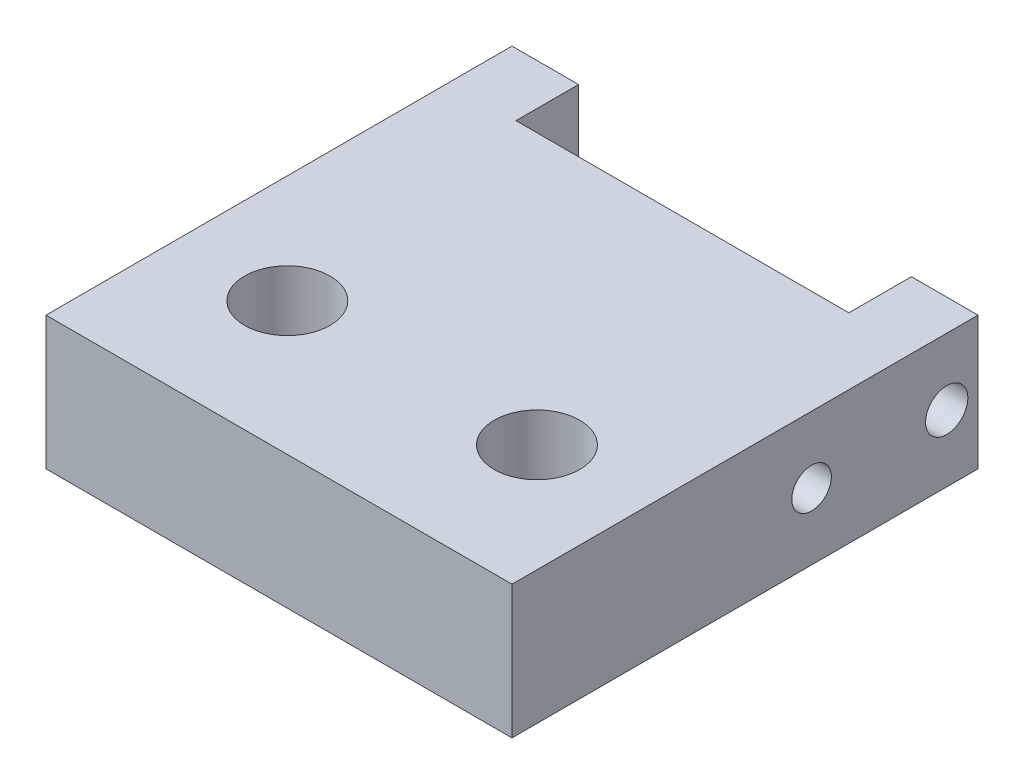
ISO-10303-21;
HEADER;
FILE_DESCRIPTION(('STEP AP214'),'2;1');
FILE_NAME('part.step','',(''),(''),'','','');
FILE_SCHEMA(('AUTOMOTIVE_DESIGN { 1 0 10303 214 1 1 1 1 }'));
ENDSEC;
DATA;
#1=APPLICATION_CONTEXT('core data for automotive mechanical design processes');
#2=APPLICATION_PROTOCOL_DEFINITION('international standard','automotive_design',2000,#1);
#3=PRODUCT_CONTEXT('',#1,'mechanical');
#4=PRODUCT('Part','Part','',(#3));
#5=PRODUCT_RELATED_PRODUCT_CATEGORY('part','',(#4));
#6=PRODUCT_DEFINITION_FORMATION('','',#4);
#7=PRODUCT_DEFINITION_CONTEXT('part definition',#1,'design');
#8=PRODUCT_DEFINITION('design','',#6,#7);
#9=PRODUCT_DEFINITION_SHAPE('','',#8);
#10=(LENGTH_UNIT() NAMED_UNIT(*) SI_UNIT(.MILLI.,.METRE.));
#11=(NAMED_UNIT(*) PLANE_ANGLE_UNIT() SI_UNIT($,.RADIAN.));
#12=(NAMED_UNIT(*) SI_UNIT($,.STERADIAN.) SOLID_ANGLE_UNIT());
#13=UNCERTAINTY_MEASURE_WITH_UNIT(LENGTH_MEASURE(1.E-05),#10,'distance_accuracy_value','');
#14=(GEOMETRIC_REPRESENTATION_CONTEXT(3) GLOBAL_UNCERTAINTY_ASSIGNED_CONTEXT((#13)) GLOBAL_UNIT_ASSIGNED_CONTEXT((#10,
#11,#12)) REPRESENTATION_CONTEXT('',''));
#15=CARTESIAN_POINT('',(0.,0.,0.));
#16=DIRECTION('',(0.,0.,1.));
#17=DIRECTION('',(1.,0.,0.));
#18=AXIS2_PLACEMENT_3D('',#15,#16,#17);
#19=CARTESIAN_POINT('',(-8.89,5.08,-8.89));
#20=DIRECTION('',(0.,0.,1.));
#21=DIRECTION('',(1.,0.,0.));
#22=AXIS2_PLACEMENT_3D('',#19,#20,#21);
#23=PLANE('',#22);
#24=DIRECTION('',(0.,-1.,0.));
#25=VECTOR('',#24,1.);
#26=CARTESIAN_POINT('',(6.34999999999999,5.08,-8.89));
#27=LINE('',#26,#25);
#28=CARTESIAN_POINT('',(6.34999999999999,5.08,-8.89));
#29=VERTEX_POINT('',#28);
#30=CARTESIAN_POINT('',(6.34999999999999,0.,-8.89));
#31=VERTEX_POINT('',#30);
#32=EDGE_CURVE('E183',#29,#31,#27,.T.);
#33=ORIENTED_EDGE('',*,*,#32,.F.);
#34=DIRECTION('',(-1.,0.,0.));
#35=VECTOR('',#34,1.);
#36=CARTESIAN_POINT('',(-8.89,5.08,-8.89));
#37=LINE('',#36,#35);
#38=CARTESIAN_POINT('',(8.89,5.08,-8.89));
#39=VERTEX_POINT('',#38);
#40=EDGE_CURVE('E100',#39,#29,#37,.T.);
#41=ORIENTED_EDGE('',*,*,#40,.F.);
#42=DIRECTION('',(0.,-1.,0.));
#43=VECTOR('',#42,1.);
#44=CARTESIAN_POINT('',(8.89,5.08,-8.89));
#45=LINE('',#44,#43);
#46=CARTESIAN_POINT('',(8.89,0.,-8.89));
#47=VERTEX_POINT('',#46);
#48=EDGE_CURVE('E175',#39,#47,#45,.T.);
#49=ORIENTED_EDGE('',*,*,#48,.T.);
#50=DIRECTION('',(-1.,0.,0.));
#51=VECTOR('',#50,1.);
#52=CARTESIAN_POINT('',(-8.89,0.,-8.89));
#53=LINE('',#52,#51);
#54=EDGE_CURVE('E148',#47,#31,#53,.T.);
#55=ORIENTED_EDGE('',*,*,#54,.T.);
#56=EDGE_LOOP('',(#33,#41,#49,#55));
#57=FACE_BOUND('',#56,.T.);
#58=ADVANCED_FACE('F45',(#57),#23,.F.);
#59=CARTESIAN_POINT('',(8.89,5.08,8.89));
#60=DIRECTION('',(-1.,0.,0.));
#61=DIRECTION('',(0.,0.,1.));
#62=AXIS2_PLACEMENT_3D('',#59,#60,#61);
#63=PLANE('',#62);
#64=CARTESIAN_POINT('',(8.89,2.54,-2.54));
#65=DIRECTION('',(1.,0.,0.));
#66=DIRECTION('',(0.,0.,-1.));
#67=AXIS2_PLACEMENT_3D('',#64,#65,#66);
#68=CIRCLE('',#67,0.755649999999988);
#69=CARTESIAN_POINT('',(8.89,2.54,-3.29564999999999));
#70=VERTEX_POINT('',#69);
#71=EDGE_CURVE('E247',#70,#70,#68,.T.);
#72=ORIENTED_EDGE('',*,*,#71,.F.);
#73=EDGE_LOOP('',(#72));
#74=FACE_BOUND('',#73,.T.);
#75=CARTESIAN_POINT('',(8.89,2.54,-7.6962));
#76=DIRECTION('',(1.,0.,0.));
#77=DIRECTION('',(0.,0.,-1.));
#78=AXIS2_PLACEMENT_3D('',#75,#76,#77);
#79=CIRCLE('',#78,0.806449999999998);
#80=CARTESIAN_POINT('',(8.89,2.54,-8.50265));
#81=VERTEX_POINT('',#80);
#82=EDGE_CURVE('E239',#81,#81,#79,.T.);
#83=ORIENTED_EDGE('',*,*,#82,.F.);
#84=EDGE_LOOP('',(#83));
#85=FACE_BOUND('',#84,.T.);
#86=DIRECTION('',(0.,0.,-1.));
#87=VECTOR('',#86,1.);
#88=CARTESIAN_POINT('',(8.89,0.,8.89));
#89=LINE('',#88,#87);
#90=CARTESIAN_POINT('',(8.89,0.,8.89));
#91=VERTEX_POINT('',#90);
#92=EDGE_CURVE('E149',#91,#47,#89,.T.);
#93=ORIENTED_EDGE('',*,*,#92,.T.);
#94=ORIENTED_EDGE('',*,*,#48,.F.);
#95=DIRECTION('',(0.,0.,-1.));
#96=VECTOR('',#95,1.);
#97=CARTESIAN_POINT('',(8.89,5.08,8.89));
#98=LINE('',#97,#96);
#99=CARTESIAN_POINT('',(8.89,5.08,8.89));
#100=VERTEX_POINT('',#99);
#101=EDGE_CURVE('E165',#100,#39,#98,.T.);
#102=ORIENTED_EDGE('',*,*,#101,.F.);
#103=DIRECTION('',(0.,-1.,0.));
#104=VECTOR('',#103,1.);
#105=CARTESIAN_POINT('',(8.89,5.08,8.89));
#106=LINE('',#105,#104);
#107=EDGE_CURVE('E166',#100,#91,#106,.T.);
#108=ORIENTED_EDGE('',*,*,#107,.T.);
#109=EDGE_LOOP('',(#93,#94,#102,#108));
#110=FACE_BOUND('',#109,.T.);
#111=ADVANCED_FACE('F47',(#74,#85,#110),#63,.F.);
#112=CARTESIAN_POINT('',(-6.35,5.08,-8.89));
#113=VERTEX_POINT('',#112);
#114=CARTESIAN_POINT('',(-8.89,5.08,-8.89));
#115=VERTEX_POINT('',#114);
#116=EDGE_CURVE('E198',#113,#115,#37,.T.);
#117=ORIENTED_EDGE('',*,*,#116,.F.);
#118=DIRECTION('',(0.,-1.,0.));
#119=VECTOR('',#118,1.);
#120=CARTESIAN_POINT('',(-6.35,5.08,-8.89));
#121=LINE('',#120,#119);
#122=CARTESIAN_POINT('',(-6.35,0.,-8.89));
#123=VERTEX_POINT('',#122);
#124=EDGE_CURVE('E157',#113,#123,#121,.T.);
#125=ORIENTED_EDGE('',*,*,#124,.T.);
#126=CARTESIAN_POINT('',(-8.89,0.,-8.89));
#127=VERTEX_POINT('',#126);
#128=EDGE_CURVE('E142',#123,#127,#53,.T.);
#129=ORIENTED_EDGE('',*,*,#128,.T.);
#130=DIRECTION('',(0.,-1.,0.));
#131=VECTOR('',#130,1.);
#132=CARTESIAN_POINT('',(-8.89,5.08,-8.89));
#133=LINE('',#132,#131);
#134=EDGE_CURVE('E172',#115,#127,#133,.T.);
#135=ORIENTED_EDGE('',*,*,#134,.F.);
#136=EDGE_LOOP('',(#117,#125,#129,#135));
#137=FACE_BOUND('',#136,.T.);
#138=ADVANCED_FACE('F258',(#137),#23,.F.);
#139=CARTESIAN_POINT('',(-8.89,5.08,8.89));
#140=DIRECTION('',(1.,0.,0.));
#141=DIRECTION('',(0.,0.,-1.));
#142=AXIS2_PLACEMENT_3D('',#139,#140,#141);
#143=PLANE('',#142);
#144=CARTESIAN_POINT('',(-8.89,2.54,-2.54));
#145=DIRECTION('',(1.,0.,0.));
#146=DIRECTION('',(0.,0.,-1.));
#147=AXIS2_PLACEMENT_3D('',#144,#145,#146);
#148=CIRCLE('',#147,0.755649999999997);
#149=CARTESIAN_POINT('',(-8.89,2.54,-3.29565));
#150=VERTEX_POINT('',#149);
#151=EDGE_CURVE('E243',#150,#150,#148,.T.);
#152=ORIENTED_EDGE('',*,*,#151,.T.);
#153=EDGE_LOOP('',(#152));
#154=FACE_BOUND('',#153,.T.);
#155=CARTESIAN_POINT('',(-8.89,2.54,-7.6962));
#156=DIRECTION('',(1.,0.,0.));
#157=DIRECTION('',(0.,0.,-1.));
#158=AXIS2_PLACEMENT_3D('',#155,#156,#157);
#159=CIRCLE('',#158,0.806449999999995);
#160=CARTESIAN_POINT('',(-8.89,2.54,-8.50264999999999));
#161=VERTEX_POINT('',#160);
#162=EDGE_CURVE('E235',#161,#161,#159,.T.);
#163=ORIENTED_EDGE('',*,*,#162,.T.);
#164=EDGE_LOOP('',(#163));
#165=FACE_BOUND('',#164,.T.);
#166=DIRECTION('',(0.,0.,1.));
#167=VECTOR('',#166,1.);
#168=CARTESIAN_POINT('',(-8.89,0.,8.89));
#169=LINE('',#168,#167);
#170=CARTESIAN_POINT('',(-8.89,0.,8.89));
#171=VERTEX_POINT('',#170);
#172=EDGE_CURVE('E143',#127,#171,#169,.T.);
#173=ORIENTED_EDGE('',*,*,#172,.T.);
#174=DIRECTION('',(0.,-1.,0.));
#175=VECTOR('',#174,1.);
#176=CARTESIAN_POINT('',(-8.89,5.08,8.89));
#177=LINE('',#176,#175);
#178=CARTESIAN_POINT('',(-8.89,5.08,8.89));
#179=VERTEX_POINT('',#178);
#180=EDGE_CURVE('E169',#179,#171,#177,.T.);
#181=ORIENTED_EDGE('',*,*,#180,.F.);
#182=DIRECTION('',(0.,0.,1.));
#183=VECTOR('',#182,1.);
#184=CARTESIAN_POINT('',(-8.89,5.08,8.89));
#185=LINE('',#184,#183);
#186=EDGE_CURVE('E190',#115,#179,#185,.T.);
#187=ORIENTED_EDGE('',*,*,#186,.F.);
#188=ORIENTED_EDGE('',*,*,#134,.T.);
#189=EDGE_LOOP('',(#173,#181,#187,#188));
#190=FACE_BOUND('',#189,.T.);
#191=ADVANCED_FACE('F282',(#154,#165,#190),#143,.F.);
#192=CARTESIAN_POINT('',(-8.89,5.08,8.89));
#193=DIRECTION('',(0.,0.,-1.));
#194=DIRECTION('',(-1.,0.,0.));
#195=AXIS2_PLACEMENT_3D('',#192,#193,#194);
#196=PLANE('',#195);
#197=DIRECTION('',(1.,0.,0.));
#198=VECTOR('',#197,1.);
#199=CARTESIAN_POINT('',(-8.89,0.,8.89));
#200=LINE('',#199,#198);
#201=EDGE_CURVE('E92',#171,#91,#200,.T.);
#202=ORIENTED_EDGE('',*,*,#201,.T.);
#203=ORIENTED_EDGE('',*,*,#107,.F.);
#204=DIRECTION('',(1.,0.,0.));
#205=VECTOR('',#204,1.);
#206=CARTESIAN_POINT('',(-8.89,5.08,8.89));
#207=LINE('',#206,#205);
#208=EDGE_CURVE('E71',#179,#100,#207,.T.);
#209=ORIENTED_EDGE('',*,*,#208,.F.);
#210=ORIENTED_EDGE('',*,*,#180,.T.);
#211=EDGE_LOOP('',(#202,#203,#209,#210));
#212=FACE_BOUND('',#211,.T.);
#213=ADVANCED_FACE('F187',(#212),#196,.F.);
#214=CARTESIAN_POINT('',(0.,5.08,0.));
#215=DIRECTION('',(0.,-1.,0.));
#216=DIRECTION('',(0.,0.,-1.));
#217=AXIS2_PLACEMENT_3D('',#214,#215,#216);
#218=PLANE('',#217);
#219=CARTESIAN_POINT('',(4.7625,5.08,3.81));
#220=DIRECTION('',(0.,1.,0.));
#221=DIRECTION('',(0.,0.,1.));
#222=AXIS2_PLACEMENT_3D('',#219,#220,#221);
#223=CIRCLE('',#222,1.63195);
#224=CARTESIAN_POINT('',(4.7625,5.08,5.44195));
#225=VERTEX_POINT('',#224);
#226=EDGE_CURVE('E227',#225,#225,#223,.T.);
#227=ORIENTED_EDGE('',*,*,#226,.F.);
#228=EDGE_LOOP('',(#227));
#229=FACE_BOUND('',#228,.T.);
#230=CARTESIAN_POINT('',(-4.7625,5.08,3.81));
#231=DIRECTION('',(0.,1.,0.));
#232=DIRECTION('',(0.,0.,1.));
#233=AXIS2_PLACEMENT_3D('',#230,#231,#232);
#234=CIRCLE('',#233,1.63195);
#235=CARTESIAN_POINT('',(-4.7625,5.08,5.44195));
#236=VERTEX_POINT('',#235);
#237=EDGE_CURVE('E219',#236,#236,#234,.T.);
#238=ORIENTED_EDGE('',*,*,#237,.F.);
#239=EDGE_LOOP('',(#238));
#240=FACE_BOUND('',#239,.T.);
#241=DIRECTION('',(1.,0.,0.));
#242=VECTOR('',#241,1.);
#243=CARTESIAN_POINT('',(-6.35,5.08,-6.5024));
#244=LINE('',#243,#242);
#245=CARTESIAN_POINT('',(-6.35,5.08,-6.5024));
#246=VERTEX_POINT('',#245);
#247=CARTESIAN_POINT('',(6.34999999999999,5.08,-6.5024));
#248=VERTEX_POINT('',#247);
#249=EDGE_CURVE('E210',#246,#248,#244,.T.);
#250=ORIENTED_EDGE('',*,*,#249,.F.);
#251=DIRECTION('',(0.,0.,1.));
#252=VECTOR('',#251,1.);
#253=CARTESIAN_POINT('',(-6.35,5.08,-11.2776));
#254=LINE('',#253,#252);
#255=EDGE_CURVE('E127',#113,#246,#254,.T.);
#256=ORIENTED_EDGE('',*,*,#255,.F.);
#257=ORIENTED_EDGE('',*,*,#116,.T.);
#258=ORIENTED_EDGE('',*,*,#186,.T.);
#259=ORIENTED_EDGE('',*,*,#208,.T.);
#260=ORIENTED_EDGE('',*,*,#101,.T.);
#261=ORIENTED_EDGE('',*,*,#40,.T.);
#262=DIRECTION('',(0.,0.,1.));
#263=VECTOR('',#262,1.);
#264=CARTESIAN_POINT('',(6.34999999999999,5.08,-11.2776));
#265=LINE('',#264,#263);
#266=EDGE_CURVE('E137',#29,#248,#265,.T.);
#267=ORIENTED_EDGE('',*,*,#266,.T.);
#268=EDGE_LOOP('',(#250,#256,#257,#258,#259,#260,#261,#267));
#269=FACE_BOUND('',#268,.T.);
#270=ADVANCED_FACE('F344',(#229,#240,#269),#218,.F.);
#271=CARTESIAN_POINT('',(0.,0.,0.));
#272=DIRECTION('',(0.,-1.,0.));
#273=DIRECTION('',(0.,0.,-1.));
#274=AXIS2_PLACEMENT_3D('',#271,#272,#273);
#275=PLANE('',#274);
#276=CARTESIAN_POINT('',(4.7625,0.,3.81));
#277=DIRECTION('',(0.,1.,0.));
#278=DIRECTION('',(0.,0.,1.));
#279=AXIS2_PLACEMENT_3D('',#276,#277,#278);
#280=CIRCLE('',#279,1.63195);
#281=CARTESIAN_POINT('',(4.7625,0.,5.44195));
#282=VERTEX_POINT('',#281);
#283=EDGE_CURVE('E223',#282,#282,#280,.T.);
#284=ORIENTED_EDGE('',*,*,#283,.T.);
#285=EDGE_LOOP('',(#284));
#286=FACE_BOUND('',#285,.T.);
#287=CARTESIAN_POINT('',(-4.7625,0.,3.81));
#288=DIRECTION('',(0.,1.,0.));
#289=DIRECTION('',(0.,0.,1.));
#290=AXIS2_PLACEMENT_3D('',#287,#288,#289);
#291=CIRCLE('',#290,1.63195);
#292=CARTESIAN_POINT('',(-4.7625,0.,5.44195));
#293=VERTEX_POINT('',#292);
#294=EDGE_CURVE('E214',#293,#293,#291,.T.);
#295=ORIENTED_EDGE('',*,*,#294,.T.);
#296=EDGE_LOOP('',(#295));
#297=FACE_BOUND('',#296,.T.);
#298=DIRECTION('',(0.,0.,-1.));
#299=VECTOR('',#298,1.);
#300=CARTESIAN_POINT('',(-6.35,0.,0.));
#301=LINE('',#300,#299);
#302=CARTESIAN_POINT('',(-6.35,0.,-6.5024));
#303=VERTEX_POINT('',#302);
#304=EDGE_CURVE('E11',#303,#123,#301,.T.);
#305=ORIENTED_EDGE('',*,*,#304,.F.);
#306=DIRECTION('',(1.,0.,0.));
#307=VECTOR('',#306,1.);
#308=CARTESIAN_POINT('',(-6.35,0.,-6.5024));
#309=LINE('',#308,#307);
#310=CARTESIAN_POINT('',(6.34999999999999,0.,-6.5024));
#311=VERTEX_POINT('',#310);
#312=EDGE_CURVE('E130',#303,#311,#309,.T.);
#313=ORIENTED_EDGE('',*,*,#312,.T.);
#314=DIRECTION('',(0.,0.,-1.));
#315=VECTOR('',#314,1.);
#316=CARTESIAN_POINT('',(6.34999999999999,0.,0.));
#317=LINE('',#316,#315);
#318=EDGE_CURVE('E55',#311,#31,#317,.T.);
#319=ORIENTED_EDGE('',*,*,#318,.T.);
#320=ORIENTED_EDGE('',*,*,#54,.F.);
#321=ORIENTED_EDGE('',*,*,#92,.F.);
#322=ORIENTED_EDGE('',*,*,#201,.F.);
#323=ORIENTED_EDGE('',*,*,#172,.F.);
#324=ORIENTED_EDGE('',*,*,#128,.F.);
#325=EDGE_LOOP('',(#305,#313,#319,#320,#321,#322,#323,#324));
#326=FACE_BOUND('',#325,.T.);
#327=ADVANCED_FACE('F140',(#286,#297,#326),#275,.T.);
#328=CARTESIAN_POINT('',(-6.35,0.,-11.2776));
#329=DIRECTION('',(-1.,0.,0.));
#330=DIRECTION('',(0.,0.,1.));
#331=AXIS2_PLACEMENT_3D('',#328,#329,#330);
#332=PLANE('',#331);
#333=CARTESIAN_POINT('',(-6.35,2.54,-7.6962));
#334=DIRECTION('',(-1.,0.,0.));
#335=DIRECTION('',(0.,0.,1.));
#336=AXIS2_PLACEMENT_3D('',#333,#334,#335);
#337=CIRCLE('',#336,0.806449999999997);
#338=CARTESIAN_POINT('',(-6.35,2.54,-6.88975));
#339=VERTEX_POINT('',#338);
#340=EDGE_CURVE('E231',#339,#339,#337,.T.);
#341=ORIENTED_EDGE('',*,*,#340,.T.);
#342=EDGE_LOOP('',(#341));
#343=FACE_BOUND('',#342,.T.);
#344=ORIENTED_EDGE('',*,*,#255,.T.);
#345=DIRECTION('',(0.,1.,0.));
#346=VECTOR('',#345,1.);
#347=CARTESIAN_POINT('',(-6.35,0.,-6.5024));
#348=LINE('',#347,#346);
#349=EDGE_CURVE('E122',#303,#246,#348,.T.);
#350=ORIENTED_EDGE('',*,*,#349,.F.);
#351=ORIENTED_EDGE('',*,*,#304,.T.);
#352=ORIENTED_EDGE('',*,*,#124,.F.);
#353=EDGE_LOOP('',(#344,#350,#351,#352));
#354=FACE_BOUND('',#353,.T.);
#355=ADVANCED_FACE('F123',(#343,#354),#332,.F.);
#356=CARTESIAN_POINT('',(6.34999999999999,0.,-11.2776));
#357=DIRECTION('',(-1.,0.,0.));
#358=DIRECTION('',(0.,0.,1.));
#359=AXIS2_PLACEMENT_3D('',#356,#357,#358);
#360=PLANE('',#359);
#361=CARTESIAN_POINT('',(6.34999999999999,2.54,-7.6962));
#362=DIRECTION('',(-1.,0.,0.));
#363=DIRECTION('',(0.,0.,1.));
#364=AXIS2_PLACEMENT_3D('',#361,#362,#363);
#365=CIRCLE('',#364,0.806449999999997);
#366=CARTESIAN_POINT('',(6.34999999999999,2.54,-6.88975));
#367=VERTEX_POINT('',#366);
#368=EDGE_CURVE('E49',#367,#367,#365,.T.);
#369=ORIENTED_EDGE('',*,*,#368,.F.);
#370=EDGE_LOOP('',(#369));
#371=FACE_BOUND('',#370,.T.);
#372=ORIENTED_EDGE('',*,*,#32,.T.);
#373=ORIENTED_EDGE('',*,*,#318,.F.);
#374=DIRECTION('',(0.,1.,0.));
#375=VECTOR('',#374,1.);
#376=CARTESIAN_POINT('',(6.34999999999999,0.,-6.5024));
#377=LINE('',#376,#375);
#378=EDGE_CURVE('E62',#311,#248,#377,.T.);
#379=ORIENTED_EDGE('',*,*,#378,.T.);
#380=ORIENTED_EDGE('',*,*,#266,.F.);
#381=EDGE_LOOP('',(#372,#373,#379,#380));
#382=FACE_BOUND('',#381,.T.);
#383=ADVANCED_FACE('F341',(#371,#382),#360,.T.);
#384=CARTESIAN_POINT('',(-6.35,0.,-6.5024));
#385=DIRECTION('',(0.,0.,1.));
#386=DIRECTION('',(1.,0.,0.));
#387=AXIS2_PLACEMENT_3D('',#384,#385,#386);
#388=PLANE('',#387);
#389=ORIENTED_EDGE('',*,*,#249,.T.);
#390=ORIENTED_EDGE('',*,*,#378,.F.);
#391=ORIENTED_EDGE('',*,*,#312,.F.);
#392=ORIENTED_EDGE('',*,*,#349,.T.);
#393=EDGE_LOOP('',(#389,#390,#391,#392));
#394=FACE_BOUND('',#393,.T.);
#395=ADVANCED_FACE('F133',(#394),#388,.F.);
#396=CARTESIAN_POINT('',(-4.7625,5.08,3.81));
#397=DIRECTION('',(0.,1.,0.));
#398=DIRECTION('',(0.,0.,1.));
#399=AXIS2_PLACEMENT_3D('',#396,#397,#398);
#400=CYLINDRICAL_SURFACE('',#399,1.63195);
#401=ORIENTED_EDGE('',*,*,#294,.F.);
#402=EDGE_LOOP('',(#401));
#403=FACE_BOUND('',#402,.T.);
#404=ORIENTED_EDGE('',*,*,#237,.T.);
#405=EDGE_LOOP('',(#404));
#406=FACE_BOUND('',#405,.T.);
#407=ADVANCED_FACE('F272',(#403,#406),#400,.F.);
#408=CARTESIAN_POINT('',(4.7625,5.08,3.81));
#409=DIRECTION('',(0.,1.,0.));
#410=DIRECTION('',(0.,0.,1.));
#411=AXIS2_PLACEMENT_3D('',#408,#409,#410);
#412=CYLINDRICAL_SURFACE('',#411,1.63195);
#413=ORIENTED_EDGE('',*,*,#283,.F.);
#414=EDGE_LOOP('',(#413));
#415=FACE_BOUND('',#414,.T.);
#416=ORIENTED_EDGE('',*,*,#226,.T.);
#417=EDGE_LOOP('',(#416));
#418=FACE_BOUND('',#417,.T.);
#419=ADVANCED_FACE('F264',(#415,#418),#412,.F.);
#420=CARTESIAN_POINT('',(8.89,2.54,-7.6962));
#421=DIRECTION('',(1.,0.,0.));
#422=DIRECTION('',(0.,0.,-1.));
#423=AXIS2_PLACEMENT_3D('',#420,#421,#422);
#424=CYLINDRICAL_SURFACE('',#423,0.806449999999997);
#425=ORIENTED_EDGE('',*,*,#368,.T.);
#426=EDGE_LOOP('',(#425));
#427=FACE_BOUND('',#426,.T.);
#428=ORIENTED_EDGE('',*,*,#82,.T.);
#429=EDGE_LOOP('',(#428));
#430=FACE_BOUND('',#429,.T.);
#431=ADVANCED_FACE('F261',(#427,#430),#424,.F.);
#432=ORIENTED_EDGE('',*,*,#162,.F.);
#433=EDGE_LOOP('',(#432));
#434=FACE_BOUND('',#433,.T.);
#435=ORIENTED_EDGE('',*,*,#340,.F.);
#436=EDGE_LOOP('',(#435));
#437=FACE_BOUND('',#436,.T.);
#438=ADVANCED_FACE('F263',(#434,#437),#424,.F.);
#439=CARTESIAN_POINT('',(8.89,2.54,-2.54));
#440=DIRECTION('',(1.,0.,0.));
#441=DIRECTION('',(0.,0.,-1.));
#442=AXIS2_PLACEMENT_3D('',#439,#440,#441);
#443=CYLINDRICAL_SURFACE('',#442,0.755649999999992);
#444=ORIENTED_EDGE('',*,*,#151,.F.);
#445=EDGE_LOOP('',(#444));
#446=FACE_BOUND('',#445,.T.);
#447=ORIENTED_EDGE('',*,*,#71,.T.);
#448=EDGE_LOOP('',(#447));
#449=FACE_BOUND('',#448,.T.);
#450=ADVANCED_FACE('F254',(#446,#449),#443,.F.);
#451=CLOSED_SHELL('',(#58,#111,#138,#191,#213,#270,#327,#355,#383,#395,#407,#419,#431,#438,#450));
#452=MANIFOLD_SOLID_BREP('B2',#451);
#453=ADVANCED_BREP_SHAPE_REPRESENTATION('',(#18,#452),#14);
#454=SHAPE_DEFINITION_REPRESENTATION(#9,#453);
ENDSEC;
END-ISO-10303-21;
